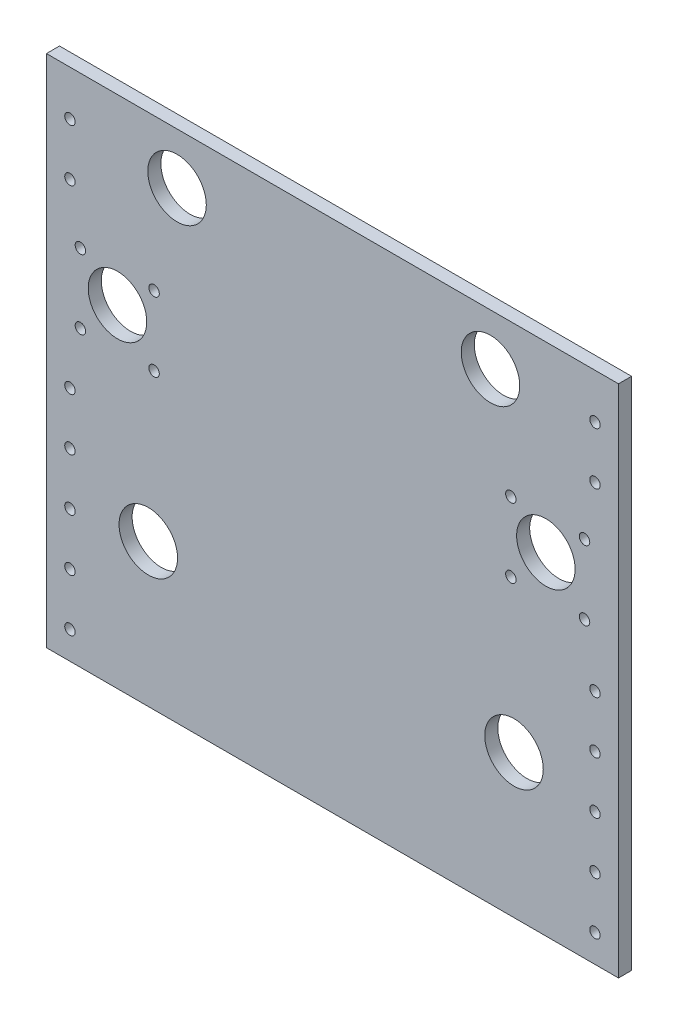
ISO-10303-21;
HEADER;
FILE_DESCRIPTION(('STEP AP214'),'2;1');
FILE_NAME('part.step','',(''),(''),'','','');
FILE_SCHEMA(('AUTOMOTIVE_DESIGN { 1 0 10303 214 1 1 1 1 }'));
ENDSEC;
DATA;
#1=APPLICATION_CONTEXT('core data for automotive mechanical design processes');
#2=APPLICATION_PROTOCOL_DEFINITION('international standard','automotive_design',2000,#1);
#3=PRODUCT_CONTEXT('',#1,'mechanical');
#4=PRODUCT('Part','Part','',(#3));
#5=PRODUCT_RELATED_PRODUCT_CATEGORY('part','',(#4));
#6=PRODUCT_DEFINITION_FORMATION('','',#4);
#7=PRODUCT_DEFINITION_CONTEXT('part definition',#1,'design');
#8=PRODUCT_DEFINITION('design','',#6,#7);
#9=PRODUCT_DEFINITION_SHAPE('','',#8);
#10=(LENGTH_UNIT() NAMED_UNIT(*) SI_UNIT(.MILLI.,.METRE.));
#11=(NAMED_UNIT(*) PLANE_ANGLE_UNIT() SI_UNIT($,.RADIAN.));
#12=(NAMED_UNIT(*) SI_UNIT($,.STERADIAN.) SOLID_ANGLE_UNIT());
#13=UNCERTAINTY_MEASURE_WITH_UNIT(LENGTH_MEASURE(1.E-05),#10,'distance_accuracy_value','');
#14=(GEOMETRIC_REPRESENTATION_CONTEXT(3) GLOBAL_UNCERTAINTY_ASSIGNED_CONTEXT((#13)) GLOBAL_UNIT_ASSIGNED_CONTEXT((#10,
#11,#12)) REPRESENTATION_CONTEXT('',''));
#15=CARTESIAN_POINT('',(0.,0.,0.));
#16=DIRECTION('',(0.,0.,1.));
#17=DIRECTION('',(1.,0.,0.));
#18=AXIS2_PLACEMENT_3D('',#15,#16,#17);
#19=CARTESIAN_POINT('',(0.,250.19,6.35));
#20=DIRECTION('',(0.,1.,0.));
#21=DIRECTION('',(0.,0.,1.));
#22=AXIS2_PLACEMENT_3D('',#19,#20,#21);
#23=PLANE('',#22);
#24=DIRECTION('',(1.,0.,0.));
#25=VECTOR('',#24,1.);
#26=CARTESIAN_POINT('',(0.,250.19,0.));
#27=LINE('',#26,#25);
#28=CARTESIAN_POINT('',(0.,250.19,0.));
#29=VERTEX_POINT('',#28);
#30=CARTESIAN_POINT('',(278.13,250.19,0.));
#31=VERTEX_POINT('',#30);
#32=EDGE_CURVE('E116',#29,#31,#27,.T.);
#33=ORIENTED_EDGE('',*,*,#32,.F.);
#34=DIRECTION('',(0.,0.,-1.));
#35=VECTOR('',#34,1.);
#36=CARTESIAN_POINT('',(0.,250.19,6.35));
#37=LINE('',#36,#35);
#38=CARTESIAN_POINT('',(0.,250.19,6.35));
#39=VERTEX_POINT('',#38);
#40=EDGE_CURVE('E11',#39,#29,#37,.T.);
#41=ORIENTED_EDGE('',*,*,#40,.F.);
#42=DIRECTION('',(1.,0.,0.));
#43=VECTOR('',#42,1.);
#44=CARTESIAN_POINT('',(0.,250.19,6.35));
#45=LINE('',#44,#43);
#46=CARTESIAN_POINT('',(278.13,250.19,6.35));
#47=VERTEX_POINT('',#46);
#48=EDGE_CURVE('E107',#39,#47,#45,.T.);
#49=ORIENTED_EDGE('',*,*,#48,.T.);
#50=DIRECTION('',(0.,0.,-1.));
#51=VECTOR('',#50,1.);
#52=CARTESIAN_POINT('',(278.13,250.19,6.35));
#53=LINE('',#52,#51);
#54=EDGE_CURVE('E48',#47,#31,#53,.T.);
#55=ORIENTED_EDGE('',*,*,#54,.T.);
#56=EDGE_LOOP('',(#33,#41,#49,#55));
#57=FACE_BOUND('',#56,.T.);
#58=ADVANCED_FACE('F45',(#57),#23,.T.);
#59=CARTESIAN_POINT('',(0.,0.,6.35));
#60=DIRECTION('',(-1.,0.,0.));
#61=DIRECTION('',(0.,-1.,0.));
#62=AXIS2_PLACEMENT_3D('',#59,#60,#61);
#63=PLANE('',#62);
#64=DIRECTION('',(0.,1.,0.));
#65=VECTOR('',#64,1.);
#66=CARTESIAN_POINT('',(0.,0.,0.));
#67=LINE('',#66,#65);
#68=CARTESIAN_POINT('',(0.,0.,0.));
#69=VERTEX_POINT('',#68);
#70=EDGE_CURVE('E110',#69,#29,#67,.T.);
#71=ORIENTED_EDGE('',*,*,#70,.F.);
#72=DIRECTION('',(0.,0.,-1.));
#73=VECTOR('',#72,1.);
#74=CARTESIAN_POINT('',(0.,0.,6.35));
#75=LINE('',#74,#73);
#76=CARTESIAN_POINT('',(0.,0.,6.35));
#77=VERTEX_POINT('',#76);
#78=EDGE_CURVE('E55',#77,#69,#75,.T.);
#79=ORIENTED_EDGE('',*,*,#78,.F.);
#80=DIRECTION('',(0.,1.,0.));
#81=VECTOR('',#80,1.);
#82=CARTESIAN_POINT('',(0.,0.,6.35));
#83=LINE('',#82,#81);
#84=EDGE_CURVE('E94',#77,#39,#83,.T.);
#85=ORIENTED_EDGE('',*,*,#84,.T.);
#86=ORIENTED_EDGE('',*,*,#40,.T.);
#87=EDGE_LOOP('',(#71,#79,#85,#86));
#88=FACE_BOUND('',#87,.T.);
#89=ADVANCED_FACE('F133',(#88),#63,.T.);
#90=CARTESIAN_POINT('',(0.,0.,6.35));
#91=DIRECTION('',(0.,1.,0.));
#92=DIRECTION('',(0.,0.,1.));
#93=AXIS2_PLACEMENT_3D('',#90,#91,#92);
#94=PLANE('',#93);
#95=DIRECTION('',(1.,0.,0.));
#96=VECTOR('',#95,1.);
#97=CARTESIAN_POINT('',(0.,0.,0.));
#98=LINE('',#97,#96);
#99=CARTESIAN_POINT('',(278.13,0.,0.));
#100=VERTEX_POINT('',#99);
#101=EDGE_CURVE('E100',#69,#100,#98,.T.);
#102=ORIENTED_EDGE('',*,*,#101,.T.);
#103=DIRECTION('',(0.,0.,-1.));
#104=VECTOR('',#103,1.);
#105=CARTESIAN_POINT('',(278.13,0.,6.35));
#106=LINE('',#105,#104);
#107=CARTESIAN_POINT('',(278.13,0.,6.35));
#108=VERTEX_POINT('',#107);
#109=EDGE_CURVE('E98',#108,#100,#106,.T.);
#110=ORIENTED_EDGE('',*,*,#109,.F.);
#111=DIRECTION('',(1.,0.,0.));
#112=VECTOR('',#111,1.);
#113=CARTESIAN_POINT('',(0.,0.,6.35));
#114=LINE('',#113,#112);
#115=EDGE_CURVE('E91',#77,#108,#114,.T.);
#116=ORIENTED_EDGE('',*,*,#115,.F.);
#117=ORIENTED_EDGE('',*,*,#78,.T.);
#118=EDGE_LOOP('',(#102,#110,#116,#117));
#119=FACE_BOUND('',#118,.T.);
#120=ADVANCED_FACE('F99',(#119),#94,.F.);
#121=CARTESIAN_POINT('',(278.13,0.,6.35));
#122=DIRECTION('',(-1.,0.,0.));
#123=DIRECTION('',(0.,-1.,0.));
#124=AXIS2_PLACEMENT_3D('',#121,#122,#123);
#125=PLANE('',#124);
#126=DIRECTION('',(0.,1.,0.));
#127=VECTOR('',#126,1.);
#128=CARTESIAN_POINT('',(278.13,0.,0.));
#129=LINE('',#128,#127);
#130=EDGE_CURVE('E120',#100,#31,#129,.T.);
#131=ORIENTED_EDGE('',*,*,#130,.T.);
#132=ORIENTED_EDGE('',*,*,#54,.F.);
#133=DIRECTION('',(0.,1.,0.));
#134=VECTOR('',#133,1.);
#135=CARTESIAN_POINT('',(278.13,0.,6.35));
#136=LINE('',#135,#134);
#137=EDGE_CURVE('E88',#108,#47,#136,.T.);
#138=ORIENTED_EDGE('',*,*,#137,.F.);
#139=ORIENTED_EDGE('',*,*,#109,.T.);
#140=EDGE_LOOP('',(#131,#132,#138,#139));
#141=FACE_BOUND('',#140,.T.);
#142=ADVANCED_FACE('F105',(#141),#125,.F.);
#143=CARTESIAN_POINT('',(0.,0.,6.35));
#144=DIRECTION('',(0.,0.,1.));
#145=DIRECTION('',(1.,0.,0.));
#146=AXIS2_PLACEMENT_3D('',#143,#144,#145);
#147=PLANE('',#146);
#148=CARTESIAN_POINT('',(16.51,142.748,6.35));
#149=DIRECTION('',(0.,0.,1.));
#150=DIRECTION('',(1.,0.,0.));
#151=AXIS2_PLACEMENT_3D('',#148,#149,#150);
#152=CIRCLE('',#151,2.54);
#153=CARTESIAN_POINT('',(19.05,142.748,6.35));
#154=VERTEX_POINT('',#153);
#155=EDGE_CURVE('E333',#154,#154,#152,.T.);
#156=ORIENTED_EDGE('',*,*,#155,.F.);
#157=EDGE_LOOP('',(#156));
#158=FACE_BOUND('',#157,.T.);
#159=CARTESIAN_POINT('',(52.324,142.748,6.35));
#160=DIRECTION('',(0.,0.,1.));
#161=DIRECTION('',(1.,0.,0.));
#162=AXIS2_PLACEMENT_3D('',#159,#160,#161);
#163=CIRCLE('',#162,2.54);
#164=CARTESIAN_POINT('',(54.864,142.748,6.35));
#165=VERTEX_POINT('',#164);
#166=EDGE_CURVE('E329',#165,#165,#163,.T.);
#167=ORIENTED_EDGE('',*,*,#166,.F.);
#168=EDGE_LOOP('',(#167));
#169=FACE_BOUND('',#168,.T.);
#170=CARTESIAN_POINT('',(52.324,176.53,6.35));
#171=DIRECTION('',(0.,0.,1.));
#172=DIRECTION('',(1.,0.,0.));
#173=AXIS2_PLACEMENT_3D('',#170,#171,#172);
#174=CIRCLE('',#173,2.54000000000002);
#175=CARTESIAN_POINT('',(54.864,176.53,6.35));
#176=VERTEX_POINT('',#175);
#177=EDGE_CURVE('E325',#176,#176,#174,.T.);
#178=ORIENTED_EDGE('',*,*,#177,.F.);
#179=EDGE_LOOP('',(#178));
#180=FACE_BOUND('',#179,.T.);
#181=CARTESIAN_POINT('',(225.806,176.53,6.35));
#182=DIRECTION('',(0.,0.,1.));
#183=DIRECTION('',(1.,0.,0.));
#184=AXIS2_PLACEMENT_3D('',#181,#182,#183);
#185=CIRCLE('',#184,2.53999999999998);
#186=CARTESIAN_POINT('',(228.346,176.53,6.35));
#187=VERTEX_POINT('',#186);
#188=EDGE_CURVE('E321',#187,#187,#185,.T.);
#189=ORIENTED_EDGE('',*,*,#188,.F.);
#190=EDGE_LOOP('',(#189));
#191=FACE_BOUND('',#190,.T.);
#192=CARTESIAN_POINT('',(261.62,142.748,6.35));
#193=DIRECTION('',(0.,0.,1.));
#194=DIRECTION('',(1.,0.,0.));
#195=AXIS2_PLACEMENT_3D('',#192,#193,#194);
#196=CIRCLE('',#195,2.54000000000006);
#197=CARTESIAN_POINT('',(264.16,142.748,6.35));
#198=VERTEX_POINT('',#197);
#199=EDGE_CURVE('E271',#198,#198,#196,.T.);
#200=ORIENTED_EDGE('',*,*,#199,.F.);
#201=EDGE_LOOP('',(#200));
#202=FACE_BOUND('',#201,.T.);
#203=CARTESIAN_POINT('',(225.806,142.748,6.35));
#204=DIRECTION('',(0.,0.,1.));
#205=DIRECTION('',(1.,0.,0.));
#206=AXIS2_PLACEMENT_3D('',#203,#204,#205);
#207=CIRCLE('',#206,2.53999999999998);
#208=CARTESIAN_POINT('',(228.346,142.748,6.35));
#209=VERTEX_POINT('',#208);
#210=EDGE_CURVE('E315',#209,#209,#207,.T.);
#211=ORIENTED_EDGE('',*,*,#210,.F.);
#212=EDGE_LOOP('',(#211));
#213=FACE_BOUND('',#212,.T.);
#214=CARTESIAN_POINT('',(261.62,176.53,6.35));
#215=DIRECTION('',(0.,0.,1.));
#216=DIRECTION('',(1.,0.,0.));
#217=AXIS2_PLACEMENT_3D('',#214,#215,#216);
#218=CIRCLE('',#217,2.54000000000001);
#219=CARTESIAN_POINT('',(264.16,176.53,6.35));
#220=VERTEX_POINT('',#219);
#221=EDGE_CURVE('E311',#220,#220,#218,.T.);
#222=ORIENTED_EDGE('',*,*,#221,.F.);
#223=EDGE_LOOP('',(#222));
#224=FACE_BOUND('',#223,.T.);
#225=CARTESIAN_POINT('',(16.51,176.53,6.35));
#226=DIRECTION('',(0.,0.,1.));
#227=DIRECTION('',(1.,0.,0.));
#228=AXIS2_PLACEMENT_3D('',#225,#226,#227);
#229=CIRCLE('',#228,2.54000000000001);
#230=CARTESIAN_POINT('',(19.05,176.53,6.35));
#231=VERTEX_POINT('',#230);
#232=EDGE_CURVE('E307',#231,#231,#229,.T.);
#233=ORIENTED_EDGE('',*,*,#232,.F.);
#234=EDGE_LOOP('',(#233));
#235=FACE_BOUND('',#234,.T.);
#236=CARTESIAN_POINT('',(11.43,115.062,6.35));
#237=DIRECTION('',(0.,0.,1.));
#238=DIRECTION('',(1.,0.,0.));
#239=AXIS2_PLACEMENT_3D('',#236,#237,#238);
#240=CIRCLE('',#239,2.54000000000001);
#241=CARTESIAN_POINT('',(13.97,115.062,6.35));
#242=VERTEX_POINT('',#241);
#243=EDGE_CURVE('E445',#242,#242,#240,.T.);
#244=ORIENTED_EDGE('',*,*,#243,.F.);
#245=EDGE_LOOP('',(#244));
#246=FACE_BOUND('',#245,.T.);
#247=CARTESIAN_POINT('',(266.7,228.346,6.35));
#248=DIRECTION('',(0.,0.,1.));
#249=DIRECTION('',(1.,0.,0.));
#250=AXIS2_PLACEMENT_3D('',#247,#248,#249);
#251=CIRCLE('',#250,2.54000000000001);
#252=CARTESIAN_POINT('',(269.24,228.346,6.35));
#253=VERTEX_POINT('',#252);
#254=EDGE_CURVE('E441',#253,#253,#251,.T.);
#255=ORIENTED_EDGE('',*,*,#254,.F.);
#256=EDGE_LOOP('',(#255));
#257=FACE_BOUND('',#256,.T.);
#258=CARTESIAN_POINT('',(266.7,202.946,6.35));
#259=DIRECTION('',(0.,0.,1.));
#260=DIRECTION('',(1.,0.,0.));
#261=AXIS2_PLACEMENT_3D('',#258,#259,#260);
#262=CIRCLE('',#261,2.54000000000001);
#263=CARTESIAN_POINT('',(269.24,202.946,6.35));
#264=VERTEX_POINT('',#263);
#265=EDGE_CURVE('E437',#264,#264,#262,.T.);
#266=ORIENTED_EDGE('',*,*,#265,.F.);
#267=EDGE_LOOP('',(#266));
#268=FACE_BOUND('',#267,.T.);
#269=CARTESIAN_POINT('',(11.43,202.946,6.35));
#270=DIRECTION('',(0.,0.,1.));
#271=DIRECTION('',(1.,0.,0.));
#272=AXIS2_PLACEMENT_3D('',#269,#270,#271);
#273=CIRCLE('',#272,2.54000000000001);
#274=CARTESIAN_POINT('',(13.97,202.946,6.35));
#275=VERTEX_POINT('',#274);
#276=EDGE_CURVE('E433',#275,#275,#273,.T.);
#277=ORIENTED_EDGE('',*,*,#276,.F.);
#278=EDGE_LOOP('',(#277));
#279=FACE_BOUND('',#278,.T.);
#280=CARTESIAN_POINT('',(11.43,89.662,6.35));
#281=DIRECTION('',(0.,0.,1.));
#282=DIRECTION('',(1.,0.,0.));
#283=AXIS2_PLACEMENT_3D('',#280,#281,#282);
#284=CIRCLE('',#283,2.54);
#285=CARTESIAN_POINT('',(13.97,89.662,6.35));
#286=VERTEX_POINT('',#285);
#287=EDGE_CURVE('E429',#286,#286,#284,.T.);
#288=ORIENTED_EDGE('',*,*,#287,.F.);
#289=EDGE_LOOP('',(#288));
#290=FACE_BOUND('',#289,.T.);
#291=CARTESIAN_POINT('',(11.43,64.262,6.35));
#292=DIRECTION('',(0.,0.,1.));
#293=DIRECTION('',(1.,0.,0.));
#294=AXIS2_PLACEMENT_3D('',#291,#292,#293);
#295=CIRCLE('',#294,2.53999999999999);
#296=CARTESIAN_POINT('',(13.97,64.262,6.35));
#297=VERTEX_POINT('',#296);
#298=EDGE_CURVE('E425',#297,#297,#295,.T.);
#299=ORIENTED_EDGE('',*,*,#298,.F.);
#300=EDGE_LOOP('',(#299));
#301=FACE_BOUND('',#300,.T.);
#302=CARTESIAN_POINT('',(11.43,38.862,6.35));
#303=DIRECTION('',(0.,0.,1.));
#304=DIRECTION('',(1.,0.,0.));
#305=AXIS2_PLACEMENT_3D('',#302,#303,#304);
#306=CIRCLE('',#305,2.54);
#307=CARTESIAN_POINT('',(13.97,38.862,6.35));
#308=VERTEX_POINT('',#307);
#309=EDGE_CURVE('E421',#308,#308,#306,.T.);
#310=ORIENTED_EDGE('',*,*,#309,.F.);
#311=EDGE_LOOP('',(#310));
#312=FACE_BOUND('',#311,.T.);
#313=CARTESIAN_POINT('',(11.43,13.462,6.35));
#314=DIRECTION('',(0.,0.,1.));
#315=DIRECTION('',(1.,0.,0.));
#316=AXIS2_PLACEMENT_3D('',#313,#314,#315);
#317=CIRCLE('',#316,2.54);
#318=CARTESIAN_POINT('',(13.97,13.462,6.35));
#319=VERTEX_POINT('',#318);
#320=EDGE_CURVE('E417',#319,#319,#317,.T.);
#321=ORIENTED_EDGE('',*,*,#320,.F.);
#322=EDGE_LOOP('',(#321));
#323=FACE_BOUND('',#322,.T.);
#324=CARTESIAN_POINT('',(266.7,115.062,6.35));
#325=DIRECTION('',(0.,0.,1.));
#326=DIRECTION('',(1.,0.,0.));
#327=AXIS2_PLACEMENT_3D('',#324,#325,#326);
#328=CIRCLE('',#327,2.54000000000001);
#329=CARTESIAN_POINT('',(269.24,115.062,6.35));
#330=VERTEX_POINT('',#329);
#331=EDGE_CURVE('E413',#330,#330,#328,.T.);
#332=ORIENTED_EDGE('',*,*,#331,.F.);
#333=EDGE_LOOP('',(#332));
#334=FACE_BOUND('',#333,.T.);
#335=CARTESIAN_POINT('',(266.7,89.662,6.35));
#336=DIRECTION('',(0.,0.,1.));
#337=DIRECTION('',(1.,0.,0.));
#338=AXIS2_PLACEMENT_3D('',#335,#336,#337);
#339=CIRCLE('',#338,2.54000000000001);
#340=CARTESIAN_POINT('',(269.24,89.662,6.35));
#341=VERTEX_POINT('',#340);
#342=EDGE_CURVE('E409',#341,#341,#339,.T.);
#343=ORIENTED_EDGE('',*,*,#342,.F.);
#344=EDGE_LOOP('',(#343));
#345=FACE_BOUND('',#344,.T.);
#346=CARTESIAN_POINT('',(266.7,64.262,6.35));
#347=DIRECTION('',(0.,0.,1.));
#348=DIRECTION('',(1.,0.,0.));
#349=AXIS2_PLACEMENT_3D('',#346,#347,#348);
#350=CIRCLE('',#349,2.54000000000001);
#351=CARTESIAN_POINT('',(269.24,64.262,6.35));
#352=VERTEX_POINT('',#351);
#353=EDGE_CURVE('E405',#352,#352,#350,.T.);
#354=ORIENTED_EDGE('',*,*,#353,.F.);
#355=EDGE_LOOP('',(#354));
#356=FACE_BOUND('',#355,.T.);
#357=CARTESIAN_POINT('',(266.7,38.862,6.35));
#358=DIRECTION('',(0.,0.,1.));
#359=DIRECTION('',(1.,0.,0.));
#360=AXIS2_PLACEMENT_3D('',#357,#358,#359);
#361=CIRCLE('',#360,2.54000000000001);
#362=CARTESIAN_POINT('',(269.24,38.862,6.35));
#363=VERTEX_POINT('',#362);
#364=EDGE_CURVE('E401',#363,#363,#361,.T.);
#365=ORIENTED_EDGE('',*,*,#364,.F.);
#366=EDGE_LOOP('',(#365));
#367=FACE_BOUND('',#366,.T.);
#368=CARTESIAN_POINT('',(266.7,13.462,6.35));
#369=DIRECTION('',(0.,0.,1.));
#370=DIRECTION('',(1.,0.,0.));
#371=AXIS2_PLACEMENT_3D('',#368,#369,#370);
#372=CIRCLE('',#371,2.54000000000001);
#373=CARTESIAN_POINT('',(269.24,13.462,6.35));
#374=VERTEX_POINT('',#373);
#375=EDGE_CURVE('E397',#374,#374,#372,.T.);
#376=ORIENTED_EDGE('',*,*,#375,.F.);
#377=EDGE_LOOP('',(#376));
#378=FACE_BOUND('',#377,.T.);
#379=CARTESIAN_POINT('',(11.43,228.346,6.35));
#380=DIRECTION('',(0.,0.,1.));
#381=DIRECTION('',(1.,0.,0.));
#382=AXIS2_PLACEMENT_3D('',#379,#380,#381);
#383=CIRCLE('',#382,2.54000000000001);
#384=CARTESIAN_POINT('',(13.97,228.346,6.35));
#385=VERTEX_POINT('',#384);
#386=EDGE_CURVE('E393',#385,#385,#383,.T.);
#387=ORIENTED_EDGE('',*,*,#386,.F.);
#388=EDGE_LOOP('',(#387));
#389=FACE_BOUND('',#388,.T.);
#390=CARTESIAN_POINT('',(49.53,69.596,6.35));
#391=DIRECTION('',(0.,0.,1.));
#392=DIRECTION('',(1.,0.,0.));
#393=AXIS2_PLACEMENT_3D('',#390,#391,#392);
#394=CIRCLE('',#393,14.224);
#395=CARTESIAN_POINT('',(63.754,69.596,6.35));
#396=VERTEX_POINT('',#395);
#397=EDGE_CURVE('E121',#396,#396,#394,.T.);
#398=ORIENTED_EDGE('',*,*,#397,.F.);
#399=EDGE_LOOP('',(#398));
#400=FACE_BOUND('',#399,.T.);
#401=CARTESIAN_POINT('',(242.824,161.544,6.35));
#402=DIRECTION('',(0.,0.,1.));
#403=DIRECTION('',(1.,0.,0.));
#404=AXIS2_PLACEMENT_3D('',#401,#402,#403);
#405=CIRCLE('',#404,14.224);
#406=CARTESIAN_POINT('',(257.048,161.544,6.35));
#407=VERTEX_POINT('',#406);
#408=EDGE_CURVE('E489',#407,#407,#405,.T.);
#409=ORIENTED_EDGE('',*,*,#408,.F.);
#410=EDGE_LOOP('',(#409));
#411=FACE_BOUND('',#410,.T.);
#412=CARTESIAN_POINT('',(34.544,161.544,6.35));
#413=DIRECTION('',(0.,0.,1.));
#414=DIRECTION('',(1.,0.,0.));
#415=AXIS2_PLACEMENT_3D('',#412,#413,#414);
#416=CIRCLE('',#415,14.224);
#417=CARTESIAN_POINT('',(48.768,161.544,6.35));
#418=VERTEX_POINT('',#417);
#419=EDGE_CURVE('E485',#418,#418,#416,.T.);
#420=ORIENTED_EDGE('',*,*,#419,.F.);
#421=EDGE_LOOP('',(#420));
#422=FACE_BOUND('',#421,.T.);
#423=CARTESIAN_POINT('',(215.9,225.298,6.35));
#424=DIRECTION('',(0.,0.,1.));
#425=DIRECTION('',(1.,0.,0.));
#426=AXIS2_PLACEMENT_3D('',#423,#424,#425);
#427=CIRCLE('',#426,14.2240000000001);
#428=CARTESIAN_POINT('',(230.124,225.298,6.35));
#429=VERTEX_POINT('',#428);
#430=EDGE_CURVE('E481',#429,#429,#427,.T.);
#431=ORIENTED_EDGE('',*,*,#430,.F.);
#432=EDGE_LOOP('',(#431));
#433=FACE_BOUND('',#432,.T.);
#434=CARTESIAN_POINT('',(227.33,69.596,6.35));
#435=DIRECTION('',(0.,0.,1.));
#436=DIRECTION('',(1.,0.,0.));
#437=AXIS2_PLACEMENT_3D('',#434,#435,#436);
#438=CIRCLE('',#437,14.224);
#439=CARTESIAN_POINT('',(241.554,69.596,6.35));
#440=VERTEX_POINT('',#439);
#441=EDGE_CURVE('E477',#440,#440,#438,.T.);
#442=ORIENTED_EDGE('',*,*,#441,.F.);
#443=EDGE_LOOP('',(#442));
#444=FACE_BOUND('',#443,.T.);
#445=CARTESIAN_POINT('',(63.5,225.298,6.35));
#446=DIRECTION('',(0.,0.,1.));
#447=DIRECTION('',(1.,0.,0.));
#448=AXIS2_PLACEMENT_3D('',#445,#446,#447);
#449=CIRCLE('',#448,14.224);
#450=CARTESIAN_POINT('',(77.724,225.298,6.35));
#451=VERTEX_POINT('',#450);
#452=EDGE_CURVE('E473',#451,#451,#449,.T.);
#453=ORIENTED_EDGE('',*,*,#452,.F.);
#454=EDGE_LOOP('',(#453));
#455=FACE_BOUND('',#454,.T.);
#456=ORIENTED_EDGE('',*,*,#48,.F.);
#457=ORIENTED_EDGE('',*,*,#84,.F.);
#458=ORIENTED_EDGE('',*,*,#115,.T.);
#459=ORIENTED_EDGE('',*,*,#137,.T.);
#460=EDGE_LOOP('',(#456,#457,#458,#459));
#461=FACE_BOUND('',#460,.T.);
#462=ADVANCED_FACE('F93',(#158,#169,#180,#191,#202,#213,#224,#235,#246,#257,#268,#279,#290,#301,
#312,#323,#334,#345,#356,#367,#378,#389,#400,#411,#422,#433,#444,#455,#461),#147,.T.);
#463=CARTESIAN_POINT('',(0.,0.,0.));
#464=DIRECTION('',(0.,0.,1.));
#465=DIRECTION('',(1.,0.,0.));
#466=AXIS2_PLACEMENT_3D('',#463,#464,#465);
#467=PLANE('',#466);
#468=CARTESIAN_POINT('',(16.51,142.748,0.));
#469=DIRECTION('',(0.,0.,1.));
#470=DIRECTION('',(1.,0.,0.));
#471=AXIS2_PLACEMENT_3D('',#468,#469,#470);
#472=CIRCLE('',#471,2.54);
#473=CARTESIAN_POINT('',(19.05,142.748,0.));
#474=VERTEX_POINT('',#473);
#475=EDGE_CURVE('E288',#474,#474,#472,.T.);
#476=ORIENTED_EDGE('',*,*,#475,.T.);
#477=EDGE_LOOP('',(#476));
#478=FACE_BOUND('',#477,.T.);
#479=CARTESIAN_POINT('',(52.324,142.748,0.));
#480=DIRECTION('',(0.,0.,1.));
#481=DIRECTION('',(1.,0.,0.));
#482=AXIS2_PLACEMENT_3D('',#479,#480,#481);
#483=CIRCLE('',#482,2.54);
#484=CARTESIAN_POINT('',(54.864,142.748,0.));
#485=VERTEX_POINT('',#484);
#486=EDGE_CURVE('E293',#485,#485,#483,.T.);
#487=ORIENTED_EDGE('',*,*,#486,.T.);
#488=EDGE_LOOP('',(#487));
#489=FACE_BOUND('',#488,.T.);
#490=CARTESIAN_POINT('',(52.324,176.53,0.));
#491=DIRECTION('',(0.,0.,1.));
#492=DIRECTION('',(1.,0.,0.));
#493=AXIS2_PLACEMENT_3D('',#490,#491,#492);
#494=CIRCLE('',#493,2.54000000000002);
#495=CARTESIAN_POINT('',(54.864,176.53,0.));
#496=VERTEX_POINT('',#495);
#497=EDGE_CURVE('E297',#496,#496,#494,.T.);
#498=ORIENTED_EDGE('',*,*,#497,.T.);
#499=EDGE_LOOP('',(#498));
#500=FACE_BOUND('',#499,.T.);
#501=CARTESIAN_POINT('',(225.806,176.53,0.));
#502=DIRECTION('',(0.,0.,1.));
#503=DIRECTION('',(1.,0.,0.));
#504=AXIS2_PLACEMENT_3D('',#501,#502,#503);
#505=CIRCLE('',#504,2.53999999999998);
#506=CARTESIAN_POINT('',(228.346,176.53,0.));
#507=VERTEX_POINT('',#506);
#508=EDGE_CURVE('E286',#507,#507,#505,.T.);
#509=ORIENTED_EDGE('',*,*,#508,.T.);
#510=EDGE_LOOP('',(#509));
#511=FACE_BOUND('',#510,.T.);
#512=CARTESIAN_POINT('',(261.62,142.748,0.));
#513=DIRECTION('',(0.,0.,1.));
#514=DIRECTION('',(1.,0.,0.));
#515=AXIS2_PLACEMENT_3D('',#512,#513,#514);
#516=CIRCLE('',#515,2.54000000000006);
#517=CARTESIAN_POINT('',(264.16,142.748,0.));
#518=VERTEX_POINT('',#517);
#519=EDGE_CURVE('E274',#518,#518,#516,.T.);
#520=ORIENTED_EDGE('',*,*,#519,.T.);
#521=EDGE_LOOP('',(#520));
#522=FACE_BOUND('',#521,.T.);
#523=CARTESIAN_POINT('',(225.806,142.748,0.));
#524=DIRECTION('',(0.,0.,1.));
#525=DIRECTION('',(1.,0.,0.));
#526=AXIS2_PLACEMENT_3D('',#523,#524,#525);
#527=CIRCLE('',#526,2.53999999999998);
#528=CARTESIAN_POINT('',(228.346,142.748,0.));
#529=VERTEX_POINT('',#528);
#530=EDGE_CURVE('E277',#529,#529,#527,.T.);
#531=ORIENTED_EDGE('',*,*,#530,.T.);
#532=EDGE_LOOP('',(#531));
#533=FACE_BOUND('',#532,.T.);
#534=CARTESIAN_POINT('',(261.62,176.53,0.));
#535=DIRECTION('',(0.,0.,1.));
#536=DIRECTION('',(1.,0.,0.));
#537=AXIS2_PLACEMENT_3D('',#534,#535,#536);
#538=CIRCLE('',#537,2.54000000000001);
#539=CARTESIAN_POINT('',(264.16,176.53,0.));
#540=VERTEX_POINT('',#539);
#541=EDGE_CURVE('E281',#540,#540,#538,.T.);
#542=ORIENTED_EDGE('',*,*,#541,.T.);
#543=EDGE_LOOP('',(#542));
#544=FACE_BOUND('',#543,.T.);
#545=CARTESIAN_POINT('',(16.51,176.53,0.));
#546=DIRECTION('',(0.,0.,1.));
#547=DIRECTION('',(1.,0.,0.));
#548=AXIS2_PLACEMENT_3D('',#545,#546,#547);
#549=CIRCLE('',#548,2.54000000000001);
#550=CARTESIAN_POINT('',(19.05,176.53,0.));
#551=VERTEX_POINT('',#550);
#552=EDGE_CURVE('E292',#551,#551,#549,.T.);
#553=ORIENTED_EDGE('',*,*,#552,.T.);
#554=EDGE_LOOP('',(#553));
#555=FACE_BOUND('',#554,.T.);
#556=CARTESIAN_POINT('',(11.43,115.062,0.));
#557=DIRECTION('',(0.,0.,1.));
#558=DIRECTION('',(1.,0.,0.));
#559=AXIS2_PLACEMENT_3D('',#556,#557,#558);
#560=CIRCLE('',#559,2.54000000000001);
#561=CARTESIAN_POINT('',(13.97,115.062,0.));
#562=VERTEX_POINT('',#561);
#563=EDGE_CURVE('E363',#562,#562,#560,.T.);
#564=ORIENTED_EDGE('',*,*,#563,.T.);
#565=EDGE_LOOP('',(#564));
#566=FACE_BOUND('',#565,.T.);
#567=CARTESIAN_POINT('',(266.7,228.346,0.));
#568=DIRECTION('',(0.,0.,1.));
#569=DIRECTION('',(1.,0.,0.));
#570=AXIS2_PLACEMENT_3D('',#567,#568,#569);
#571=CIRCLE('',#570,2.54000000000001);
#572=CARTESIAN_POINT('',(269.24,228.346,0.));
#573=VERTEX_POINT('',#572);
#574=EDGE_CURVE('E358',#573,#573,#571,.T.);
#575=ORIENTED_EDGE('',*,*,#574,.T.);
#576=EDGE_LOOP('',(#575));
#577=FACE_BOUND('',#576,.T.);
#578=CARTESIAN_POINT('',(266.7,202.946,0.));
#579=DIRECTION('',(0.,0.,1.));
#580=DIRECTION('',(1.,0.,0.));
#581=AXIS2_PLACEMENT_3D('',#578,#579,#580);
#582=CIRCLE('',#581,2.54000000000001);
#583=CARTESIAN_POINT('',(269.24,202.946,0.));
#584=VERTEX_POINT('',#583);
#585=EDGE_CURVE('E362',#584,#584,#582,.T.);
#586=ORIENTED_EDGE('',*,*,#585,.T.);
#587=EDGE_LOOP('',(#586));
#588=FACE_BOUND('',#587,.T.);
#589=CARTESIAN_POINT('',(11.43,202.946,0.));
#590=DIRECTION('',(0.,0.,1.));
#591=DIRECTION('',(1.,0.,0.));
#592=AXIS2_PLACEMENT_3D('',#589,#590,#591);
#593=CIRCLE('',#592,2.54000000000001);
#594=CARTESIAN_POINT('',(13.97,202.946,0.));
#595=VERTEX_POINT('',#594);
#596=EDGE_CURVE('E368',#595,#595,#593,.T.);
#597=ORIENTED_EDGE('',*,*,#596,.T.);
#598=EDGE_LOOP('',(#597));
#599=FACE_BOUND('',#598,.T.);
#600=CARTESIAN_POINT('',(11.43,89.662,0.));
#601=DIRECTION('',(0.,0.,1.));
#602=DIRECTION('',(1.,0.,0.));
#603=AXIS2_PLACEMENT_3D('',#600,#601,#602);
#604=CIRCLE('',#603,2.54);
#605=CARTESIAN_POINT('',(13.97,89.662,0.));
#606=VERTEX_POINT('',#605);
#607=EDGE_CURVE('E367',#606,#606,#604,.T.);
#608=ORIENTED_EDGE('',*,*,#607,.T.);
#609=EDGE_LOOP('',(#608));
#610=FACE_BOUND('',#609,.T.);
#611=CARTESIAN_POINT('',(11.43,64.262,0.));
#612=DIRECTION('',(0.,0.,1.));
#613=DIRECTION('',(1.,0.,0.));
#614=AXIS2_PLACEMENT_3D('',#611,#612,#613);
#615=CIRCLE('',#614,2.53999999999999);
#616=CARTESIAN_POINT('',(13.97,64.262,0.));
#617=VERTEX_POINT('',#616);
#618=EDGE_CURVE('E379',#617,#617,#615,.T.);
#619=ORIENTED_EDGE('',*,*,#618,.T.);
#620=EDGE_LOOP('',(#619));
#621=FACE_BOUND('',#620,.T.);
#622=CARTESIAN_POINT('',(11.43,38.862,0.));
#623=DIRECTION('',(0.,0.,1.));
#624=DIRECTION('',(1.,0.,0.));
#625=AXIS2_PLACEMENT_3D('',#622,#623,#624);
#626=CIRCLE('',#625,2.54);
#627=CARTESIAN_POINT('',(13.97,38.862,0.));
#628=VERTEX_POINT('',#627);
#629=EDGE_CURVE('E383',#628,#628,#626,.T.);
#630=ORIENTED_EDGE('',*,*,#629,.T.);
#631=EDGE_LOOP('',(#630));
#632=FACE_BOUND('',#631,.T.);
#633=CARTESIAN_POINT('',(11.43,13.462,0.));
#634=DIRECTION('',(0.,0.,1.));
#635=DIRECTION('',(1.,0.,0.));
#636=AXIS2_PLACEMENT_3D('',#633,#634,#635);
#637=CIRCLE('',#636,2.54);
#638=CARTESIAN_POINT('',(13.97,13.462,0.));
#639=VERTEX_POINT('',#638);
#640=EDGE_CURVE('E342',#639,#639,#637,.T.);
#641=ORIENTED_EDGE('',*,*,#640,.T.);
#642=EDGE_LOOP('',(#641));
#643=FACE_BOUND('',#642,.T.);
#644=CARTESIAN_POINT('',(266.7,115.062,0.));
#645=DIRECTION('',(0.,0.,1.));
#646=DIRECTION('',(1.,0.,0.));
#647=AXIS2_PLACEMENT_3D('',#644,#645,#646);
#648=CIRCLE('',#647,2.54000000000001);
#649=CARTESIAN_POINT('',(269.24,115.062,0.));
#650=VERTEX_POINT('',#649);
#651=EDGE_CURVE('E338',#650,#650,#648,.T.);
#652=ORIENTED_EDGE('',*,*,#651,.T.);
#653=EDGE_LOOP('',(#652));
#654=FACE_BOUND('',#653,.T.);
#655=CARTESIAN_POINT('',(266.7,89.662,0.));
#656=DIRECTION('',(0.,0.,1.));
#657=DIRECTION('',(1.,0.,0.));
#658=AXIS2_PLACEMENT_3D('',#655,#656,#657);
#659=CIRCLE('',#658,2.54000000000001);
#660=CARTESIAN_POINT('',(269.24,89.662,0.));
#661=VERTEX_POINT('',#660);
#662=EDGE_CURVE('E343',#661,#661,#659,.T.);
#663=ORIENTED_EDGE('',*,*,#662,.T.);
#664=EDGE_LOOP('',(#663));
#665=FACE_BOUND('',#664,.T.);
#666=CARTESIAN_POINT('',(266.7,64.262,0.));
#667=DIRECTION('',(0.,0.,1.));
#668=DIRECTION('',(1.,0.,0.));
#669=AXIS2_PLACEMENT_3D('',#666,#667,#668);
#670=CIRCLE('',#669,2.54000000000001);
#671=CARTESIAN_POINT('',(269.24,64.262,0.));
#672=VERTEX_POINT('',#671);
#673=EDGE_CURVE('E347',#672,#672,#670,.T.);
#674=ORIENTED_EDGE('',*,*,#673,.T.);
#675=EDGE_LOOP('',(#674));
#676=FACE_BOUND('',#675,.T.);
#677=CARTESIAN_POINT('',(266.7,38.862,0.));
#678=DIRECTION('',(0.,0.,1.));
#679=DIRECTION('',(1.,0.,0.));
#680=AXIS2_PLACEMENT_3D('',#677,#678,#679);
#681=CIRCLE('',#680,2.54000000000001);
#682=CARTESIAN_POINT('',(269.24,38.862,0.));
#683=VERTEX_POINT('',#682);
#684=EDGE_CURVE('E351',#683,#683,#681,.T.);
#685=ORIENTED_EDGE('',*,*,#684,.T.);
#686=EDGE_LOOP('',(#685));
#687=FACE_BOUND('',#686,.T.);
#688=CARTESIAN_POINT('',(266.7,13.462,0.));
#689=DIRECTION('',(0.,0.,1.));
#690=DIRECTION('',(1.,0.,0.));
#691=AXIS2_PLACEMENT_3D('',#688,#689,#690);
#692=CIRCLE('',#691,2.54000000000001);
#693=CARTESIAN_POINT('',(269.24,13.462,0.));
#694=VERTEX_POINT('',#693);
#695=EDGE_CURVE('E337',#694,#694,#692,.T.);
#696=ORIENTED_EDGE('',*,*,#695,.T.);
#697=EDGE_LOOP('',(#696));
#698=FACE_BOUND('',#697,.T.);
#699=CARTESIAN_POINT('',(11.43,228.346,0.));
#700=DIRECTION('',(0.,0.,1.));
#701=DIRECTION('',(1.,0.,0.));
#702=AXIS2_PLACEMENT_3D('',#699,#700,#701);
#703=CIRCLE('',#702,2.54000000000001);
#704=CARTESIAN_POINT('',(13.97,228.346,0.));
#705=VERTEX_POINT('',#704);
#706=EDGE_CURVE('E372',#705,#705,#703,.T.);
#707=ORIENTED_EDGE('',*,*,#706,.T.);
#708=EDGE_LOOP('',(#707));
#709=FACE_BOUND('',#708,.T.);
#710=CARTESIAN_POINT('',(49.53,69.596,0.));
#711=DIRECTION('',(0.,0.,1.));
#712=DIRECTION('',(1.,0.,0.));
#713=AXIS2_PLACEMENT_3D('',#710,#711,#712);
#714=CIRCLE('',#713,14.224);
#715=CARTESIAN_POINT('',(63.754,69.596,0.));
#716=VERTEX_POINT('',#715);
#717=EDGE_CURVE('E453',#716,#716,#714,.T.);
#718=ORIENTED_EDGE('',*,*,#717,.T.);
#719=EDGE_LOOP('',(#718));
#720=FACE_BOUND('',#719,.T.);
#721=CARTESIAN_POINT('',(242.824,161.544,0.));
#722=DIRECTION('',(0.,0.,1.));
#723=DIRECTION('',(1.,0.,0.));
#724=AXIS2_PLACEMENT_3D('',#721,#722,#723);
#725=CIRCLE('',#724,14.224);
#726=CARTESIAN_POINT('',(257.048,161.544,0.));
#727=VERTEX_POINT('',#726);
#728=EDGE_CURVE('E454',#727,#727,#725,.T.);
#729=ORIENTED_EDGE('',*,*,#728,.T.);
#730=EDGE_LOOP('',(#729));
#731=FACE_BOUND('',#730,.T.);
#732=CARTESIAN_POINT('',(34.544,161.544,0.));
#733=DIRECTION('',(0.,0.,1.));
#734=DIRECTION('',(1.,0.,0.));
#735=AXIS2_PLACEMENT_3D('',#732,#733,#734);
#736=CIRCLE('',#735,14.224);
#737=CARTESIAN_POINT('',(48.768,161.544,0.));
#738=VERTEX_POINT('',#737);
#739=EDGE_CURVE('E458',#738,#738,#736,.T.);
#740=ORIENTED_EDGE('',*,*,#739,.T.);
#741=EDGE_LOOP('',(#740));
#742=FACE_BOUND('',#741,.T.);
#743=CARTESIAN_POINT('',(215.9,225.298,0.));
#744=DIRECTION('',(0.,0.,1.));
#745=DIRECTION('',(1.,0.,0.));
#746=AXIS2_PLACEMENT_3D('',#743,#744,#745);
#747=CIRCLE('',#746,14.2240000000001);
#748=CARTESIAN_POINT('',(230.124,225.298,0.));
#749=VERTEX_POINT('',#748);
#750=EDGE_CURVE('E462',#749,#749,#747,.T.);
#751=ORIENTED_EDGE('',*,*,#750,.T.);
#752=EDGE_LOOP('',(#751));
#753=FACE_BOUND('',#752,.T.);
#754=CARTESIAN_POINT('',(227.33,69.596,0.));
#755=DIRECTION('',(0.,0.,1.));
#756=DIRECTION('',(1.,0.,0.));
#757=AXIS2_PLACEMENT_3D('',#754,#755,#756);
#758=CIRCLE('',#757,14.224);
#759=CARTESIAN_POINT('',(241.554,69.596,0.));
#760=VERTEX_POINT('',#759);
#761=EDGE_CURVE('E449',#760,#760,#758,.T.);
#762=ORIENTED_EDGE('',*,*,#761,.T.);
#763=EDGE_LOOP('',(#762));
#764=FACE_BOUND('',#763,.T.);
#765=CARTESIAN_POINT('',(63.5,225.298,0.));
#766=DIRECTION('',(0.,0.,1.));
#767=DIRECTION('',(1.,0.,0.));
#768=AXIS2_PLACEMENT_3D('',#765,#766,#767);
#769=CIRCLE('',#768,14.224);
#770=CARTESIAN_POINT('',(77.724,225.298,0.));
#771=VERTEX_POINT('',#770);
#772=EDGE_CURVE('E466',#771,#771,#769,.T.);
#773=ORIENTED_EDGE('',*,*,#772,.T.);
#774=EDGE_LOOP('',(#773));
#775=FACE_BOUND('',#774,.T.);
#776=ORIENTED_EDGE('',*,*,#32,.T.);
#777=ORIENTED_EDGE('',*,*,#130,.F.);
#778=ORIENTED_EDGE('',*,*,#101,.F.);
#779=ORIENTED_EDGE('',*,*,#70,.T.);
#780=EDGE_LOOP('',(#776,#777,#778,#779));
#781=FACE_BOUND('',#780,.T.);
#782=ADVANCED_FACE('F132',(#478,#489,#500,#511,#522,#533,#544,#555,#566,#577,#588,#599,#610,
#621,#632,#643,#654,#665,#676,#687,#698,#709,#720,#731,#742,#753,#764,#775,#781),#467,.F.);
#783=CARTESIAN_POINT('',(63.5,225.298,0.));
#784=DIRECTION('',(0.,0.,1.));
#785=DIRECTION('',(1.,0.,0.));
#786=AXIS2_PLACEMENT_3D('',#783,#784,#785);
#787=CYLINDRICAL_SURFACE('',#786,14.224);
#788=ORIENTED_EDGE('',*,*,#452,.T.);
#789=EDGE_LOOP('',(#788));
#790=FACE_BOUND('',#789,.T.);
#791=ORIENTED_EDGE('',*,*,#772,.F.);
#792=EDGE_LOOP('',(#791));
#793=FACE_BOUND('',#792,.T.);
#794=ADVANCED_FACE('F153',(#790,#793),#787,.F.);
#795=CARTESIAN_POINT('',(227.33,69.596,0.));
#796=DIRECTION('',(0.,0.,1.));
#797=DIRECTION('',(1.,0.,0.));
#798=AXIS2_PLACEMENT_3D('',#795,#796,#797);
#799=CYLINDRICAL_SURFACE('',#798,14.224);
#800=ORIENTED_EDGE('',*,*,#441,.T.);
#801=EDGE_LOOP('',(#800));
#802=FACE_BOUND('',#801,.T.);
#803=ORIENTED_EDGE('',*,*,#761,.F.);
#804=EDGE_LOOP('',(#803));
#805=FACE_BOUND('',#804,.T.);
#806=ADVANCED_FACE('F159',(#802,#805),#799,.F.);
#807=CARTESIAN_POINT('',(215.9,225.298,0.));
#808=DIRECTION('',(0.,0.,1.));
#809=DIRECTION('',(1.,0.,0.));
#810=AXIS2_PLACEMENT_3D('',#807,#808,#809);
#811=CYLINDRICAL_SURFACE('',#810,14.2240000000001);
#812=ORIENTED_EDGE('',*,*,#430,.T.);
#813=EDGE_LOOP('',(#812));
#814=FACE_BOUND('',#813,.T.);
#815=ORIENTED_EDGE('',*,*,#750,.F.);
#816=EDGE_LOOP('',(#815));
#817=FACE_BOUND('',#816,.T.);
#818=ADVANCED_FACE('F165',(#814,#817),#811,.F.);
#819=CARTESIAN_POINT('',(34.544,161.544,0.));
#820=DIRECTION('',(0.,0.,1.));
#821=DIRECTION('',(1.,0.,0.));
#822=AXIS2_PLACEMENT_3D('',#819,#820,#821);
#823=CYLINDRICAL_SURFACE('',#822,14.224);
#824=ORIENTED_EDGE('',*,*,#419,.T.);
#825=EDGE_LOOP('',(#824));
#826=FACE_BOUND('',#825,.T.);
#827=ORIENTED_EDGE('',*,*,#739,.F.);
#828=EDGE_LOOP('',(#827));
#829=FACE_BOUND('',#828,.T.);
#830=ADVANCED_FACE('F161',(#826,#829),#823,.F.);
#831=CARTESIAN_POINT('',(242.824,161.544,0.));
#832=DIRECTION('',(0.,0.,1.));
#833=DIRECTION('',(1.,0.,0.));
#834=AXIS2_PLACEMENT_3D('',#831,#832,#833);
#835=CYLINDRICAL_SURFACE('',#834,14.224);
#836=ORIENTED_EDGE('',*,*,#408,.T.);
#837=EDGE_LOOP('',(#836));
#838=FACE_BOUND('',#837,.T.);
#839=ORIENTED_EDGE('',*,*,#728,.F.);
#840=EDGE_LOOP('',(#839));
#841=FACE_BOUND('',#840,.T.);
#842=ADVANCED_FACE('F164',(#838,#841),#835,.F.);
#843=CARTESIAN_POINT('',(49.53,69.596,0.));
#844=DIRECTION('',(0.,0.,1.));
#845=DIRECTION('',(1.,0.,0.));
#846=AXIS2_PLACEMENT_3D('',#843,#844,#845);
#847=CYLINDRICAL_SURFACE('',#846,14.224);
#848=ORIENTED_EDGE('',*,*,#397,.T.);
#849=EDGE_LOOP('',(#848));
#850=FACE_BOUND('',#849,.T.);
#851=ORIENTED_EDGE('',*,*,#717,.F.);
#852=EDGE_LOOP('',(#851));
#853=FACE_BOUND('',#852,.T.);
#854=ADVANCED_FACE('F170',(#850,#853),#847,.F.);
#855=CARTESIAN_POINT('',(11.43,228.346,0.));
#856=DIRECTION('',(0.,0.,1.));
#857=DIRECTION('',(1.,0.,0.));
#858=AXIS2_PLACEMENT_3D('',#855,#856,#857);
#859=CYLINDRICAL_SURFACE('',#858,2.54000000000001);
#860=ORIENTED_EDGE('',*,*,#386,.T.);
#861=EDGE_LOOP('',(#860));
#862=FACE_BOUND('',#861,.T.);
#863=ORIENTED_EDGE('',*,*,#706,.F.);
#864=EDGE_LOOP('',(#863));
#865=FACE_BOUND('',#864,.T.);
#866=ADVANCED_FACE('F173',(#862,#865),#859,.F.);
#867=CARTESIAN_POINT('',(266.7,13.462,0.));
#868=DIRECTION('',(0.,0.,1.));
#869=DIRECTION('',(1.,0.,0.));
#870=AXIS2_PLACEMENT_3D('',#867,#868,#869);
#871=CYLINDRICAL_SURFACE('',#870,2.54000000000001);
#872=ORIENTED_EDGE('',*,*,#375,.T.);
#873=EDGE_LOOP('',(#872));
#874=FACE_BOUND('',#873,.T.);
#875=ORIENTED_EDGE('',*,*,#695,.F.);
#876=EDGE_LOOP('',(#875));
#877=FACE_BOUND('',#876,.T.);
#878=ADVANCED_FACE('F183',(#874,#877),#871,.F.);
#879=CARTESIAN_POINT('',(266.7,38.862,0.));
#880=DIRECTION('',(0.,0.,1.));
#881=DIRECTION('',(1.,0.,0.));
#882=AXIS2_PLACEMENT_3D('',#879,#880,#881);
#883=CYLINDRICAL_SURFACE('',#882,2.54000000000001);
#884=ORIENTED_EDGE('',*,*,#364,.T.);
#885=EDGE_LOOP('',(#884));
#886=FACE_BOUND('',#885,.T.);
#887=ORIENTED_EDGE('',*,*,#684,.F.);
#888=EDGE_LOOP('',(#887));
#889=FACE_BOUND('',#888,.T.);
#890=ADVANCED_FACE('F220',(#886,#889),#883,.F.);
#891=CARTESIAN_POINT('',(266.7,64.262,0.));
#892=DIRECTION('',(0.,0.,1.));
#893=DIRECTION('',(1.,0.,0.));
#894=AXIS2_PLACEMENT_3D('',#891,#892,#893);
#895=CYLINDRICAL_SURFACE('',#894,2.54000000000001);
#896=ORIENTED_EDGE('',*,*,#353,.T.);
#897=EDGE_LOOP('',(#896));
#898=FACE_BOUND('',#897,.T.);
#899=ORIENTED_EDGE('',*,*,#673,.F.);
#900=EDGE_LOOP('',(#899));
#901=FACE_BOUND('',#900,.T.);
#902=ADVANCED_FACE('F224',(#898,#901),#895,.F.);
#903=CARTESIAN_POINT('',(266.7,89.662,0.));
#904=DIRECTION('',(0.,0.,1.));
#905=DIRECTION('',(1.,0.,0.));
#906=AXIS2_PLACEMENT_3D('',#903,#904,#905);
#907=CYLINDRICAL_SURFACE('',#906,2.54000000000001);
#908=ORIENTED_EDGE('',*,*,#342,.T.);
#909=EDGE_LOOP('',(#908));
#910=FACE_BOUND('',#909,.T.);
#911=ORIENTED_EDGE('',*,*,#662,.F.);
#912=EDGE_LOOP('',(#911));
#913=FACE_BOUND('',#912,.T.);
#914=ADVANCED_FACE('F228',(#910,#913),#907,.F.);
#915=CARTESIAN_POINT('',(266.7,115.062,0.));
#916=DIRECTION('',(0.,0.,1.));
#917=DIRECTION('',(1.,0.,0.));
#918=AXIS2_PLACEMENT_3D('',#915,#916,#917);
#919=CYLINDRICAL_SURFACE('',#918,2.54000000000001);
#920=ORIENTED_EDGE('',*,*,#331,.T.);
#921=EDGE_LOOP('',(#920));
#922=FACE_BOUND('',#921,.T.);
#923=ORIENTED_EDGE('',*,*,#651,.F.);
#924=EDGE_LOOP('',(#923));
#925=FACE_BOUND('',#924,.T.);
#926=ADVANCED_FACE('F189',(#922,#925),#919,.F.);
#927=CARTESIAN_POINT('',(11.43,13.462,0.));
#928=DIRECTION('',(0.,0.,1.));
#929=DIRECTION('',(1.,0.,0.));
#930=AXIS2_PLACEMENT_3D('',#927,#928,#929);
#931=CYLINDRICAL_SURFACE('',#930,2.54);
#932=ORIENTED_EDGE('',*,*,#320,.T.);
#933=EDGE_LOOP('',(#932));
#934=FACE_BOUND('',#933,.T.);
#935=ORIENTED_EDGE('',*,*,#640,.F.);
#936=EDGE_LOOP('',(#935));
#937=FACE_BOUND('',#936,.T.);
#938=ADVANCED_FACE('F185',(#934,#937),#931,.F.);
#939=CARTESIAN_POINT('',(11.43,38.862,0.));
#940=DIRECTION('',(0.,0.,1.));
#941=DIRECTION('',(1.,0.,0.));
#942=AXIS2_PLACEMENT_3D('',#939,#940,#941);
#943=CYLINDRICAL_SURFACE('',#942,2.54);
#944=ORIENTED_EDGE('',*,*,#309,.T.);
#945=EDGE_LOOP('',(#944));
#946=FACE_BOUND('',#945,.T.);
#947=ORIENTED_EDGE('',*,*,#629,.F.);
#948=EDGE_LOOP('',(#947));
#949=FACE_BOUND('',#948,.T.);
#950=ADVANCED_FACE('F188',(#946,#949),#943,.F.);
#951=CARTESIAN_POINT('',(11.43,64.262,0.));
#952=DIRECTION('',(0.,0.,1.));
#953=DIRECTION('',(1.,0.,0.));
#954=AXIS2_PLACEMENT_3D('',#951,#952,#953);
#955=CYLINDRICAL_SURFACE('',#954,2.53999999999999);
#956=ORIENTED_EDGE('',*,*,#298,.T.);
#957=EDGE_LOOP('',(#956));
#958=FACE_BOUND('',#957,.T.);
#959=ORIENTED_EDGE('',*,*,#618,.F.);
#960=EDGE_LOOP('',(#959));
#961=FACE_BOUND('',#960,.T.);
#962=ADVANCED_FACE('F193',(#958,#961),#955,.F.);
#963=CARTESIAN_POINT('',(11.43,89.662,0.));
#964=DIRECTION('',(0.,0.,1.));
#965=DIRECTION('',(1.,0.,0.));
#966=AXIS2_PLACEMENT_3D('',#963,#964,#965);
#967=CYLINDRICAL_SURFACE('',#966,2.54);
#968=ORIENTED_EDGE('',*,*,#287,.T.);
#969=EDGE_LOOP('',(#968));
#970=FACE_BOUND('',#969,.T.);
#971=ORIENTED_EDGE('',*,*,#607,.F.);
#972=EDGE_LOOP('',(#971));
#973=FACE_BOUND('',#972,.T.);
#974=ADVANCED_FACE('F197',(#970,#973),#967,.F.);
#975=CARTESIAN_POINT('',(11.43,202.946,0.));
#976=DIRECTION('',(0.,0.,1.));
#977=DIRECTION('',(1.,0.,0.));
#978=AXIS2_PLACEMENT_3D('',#975,#976,#977);
#979=CYLINDRICAL_SURFACE('',#978,2.54000000000001);
#980=ORIENTED_EDGE('',*,*,#276,.T.);
#981=EDGE_LOOP('',(#980));
#982=FACE_BOUND('',#981,.T.);
#983=ORIENTED_EDGE('',*,*,#596,.F.);
#984=EDGE_LOOP('',(#983));
#985=FACE_BOUND('',#984,.T.);
#986=ADVANCED_FACE('F201',(#982,#985),#979,.F.);
#987=CARTESIAN_POINT('',(266.7,202.946,0.));
#988=DIRECTION('',(0.,0.,1.));
#989=DIRECTION('',(1.,0.,0.));
#990=AXIS2_PLACEMENT_3D('',#987,#988,#989);
#991=CYLINDRICAL_SURFACE('',#990,2.54000000000001);
#992=ORIENTED_EDGE('',*,*,#265,.T.);
#993=EDGE_LOOP('',(#992));
#994=FACE_BOUND('',#993,.T.);
#995=ORIENTED_EDGE('',*,*,#585,.F.);
#996=EDGE_LOOP('',(#995));
#997=FACE_BOUND('',#996,.T.);
#998=ADVANCED_FACE('F203',(#994,#997),#991,.F.);
#999=CARTESIAN_POINT('',(266.7,228.346,0.));
#1000=DIRECTION('',(0.,0.,1.));
#1001=DIRECTION('',(1.,0.,0.));
#1002=AXIS2_PLACEMENT_3D('',#999,#1000,#1001);
#1003=CYLINDRICAL_SURFACE('',#1002,2.54000000000001);
#1004=ORIENTED_EDGE('',*,*,#254,.T.);
#1005=EDGE_LOOP('',(#1004));
#1006=FACE_BOUND('',#1005,.T.);
#1007=ORIENTED_EDGE('',*,*,#574,.F.);
#1008=EDGE_LOOP('',(#1007));
#1009=FACE_BOUND('',#1008,.T.);
#1010=ADVANCED_FACE('F206',(#1006,#1009),#1003,.F.);
#1011=CARTESIAN_POINT('',(11.43,115.062,0.));
#1012=DIRECTION('',(0.,0.,1.));
#1013=DIRECTION('',(1.,0.,0.));
#1014=AXIS2_PLACEMENT_3D('',#1011,#1012,#1013);
#1015=CYLINDRICAL_SURFACE('',#1014,2.54000000000001);
#1016=ORIENTED_EDGE('',*,*,#243,.T.);
#1017=EDGE_LOOP('',(#1016));
#1018=FACE_BOUND('',#1017,.T.);
#1019=ORIENTED_EDGE('',*,*,#563,.F.);
#1020=EDGE_LOOP('',(#1019));
#1021=FACE_BOUND('',#1020,.T.);
#1022=ADVANCED_FACE('F211',(#1018,#1021),#1015,.F.);
#1023=CARTESIAN_POINT('',(16.51,176.53,0.));
#1024=DIRECTION('',(0.,0.,1.));
#1025=DIRECTION('',(1.,0.,0.));
#1026=AXIS2_PLACEMENT_3D('',#1023,#1024,#1025);
#1027=CYLINDRICAL_SURFACE('',#1026,2.54000000000001);
#1028=ORIENTED_EDGE('',*,*,#232,.T.);
#1029=EDGE_LOOP('',(#1028));
#1030=FACE_BOUND('',#1029,.T.);
#1031=ORIENTED_EDGE('',*,*,#552,.F.);
#1032=EDGE_LOOP('',(#1031));
#1033=FACE_BOUND('',#1032,.T.);
#1034=ADVANCED_FACE('F213',(#1030,#1033),#1027,.F.);
#1035=CARTESIAN_POINT('',(261.62,176.53,0.));
#1036=DIRECTION('',(0.,0.,1.));
#1037=DIRECTION('',(1.,0.,0.));
#1038=AXIS2_PLACEMENT_3D('',#1035,#1036,#1037);
#1039=CYLINDRICAL_SURFACE('',#1038,2.54000000000001);
#1040=ORIENTED_EDGE('',*,*,#221,.T.);
#1041=EDGE_LOOP('',(#1040));
#1042=FACE_BOUND('',#1041,.T.);
#1043=ORIENTED_EDGE('',*,*,#541,.F.);
#1044=EDGE_LOOP('',(#1043));
#1045=FACE_BOUND('',#1044,.T.);
#1046=ADVANCED_FACE('F238',(#1042,#1045),#1039,.F.);
#1047=CARTESIAN_POINT('',(225.806,142.748,0.));
#1048=DIRECTION('',(0.,0.,1.));
#1049=DIRECTION('',(1.,0.,0.));
#1050=AXIS2_PLACEMENT_3D('',#1047,#1048,#1049);
#1051=CYLINDRICAL_SURFACE('',#1050,2.53999999999998);
#1052=ORIENTED_EDGE('',*,*,#210,.T.);
#1053=EDGE_LOOP('',(#1052));
#1054=FACE_BOUND('',#1053,.T.);
#1055=ORIENTED_EDGE('',*,*,#530,.F.);
#1056=EDGE_LOOP('',(#1055));
#1057=FACE_BOUND('',#1056,.T.);
#1058=ADVANCED_FACE('F257',(#1054,#1057),#1051,.F.);
#1059=CARTESIAN_POINT('',(261.62,142.748,0.));
#1060=DIRECTION('',(0.,0.,1.));
#1061=DIRECTION('',(1.,0.,0.));
#1062=AXIS2_PLACEMENT_3D('',#1059,#1060,#1061);
#1063=CYLINDRICAL_SURFACE('',#1062,2.54000000000006);
#1064=ORIENTED_EDGE('',*,*,#199,.T.);
#1065=EDGE_LOOP('',(#1064));
#1066=FACE_BOUND('',#1065,.T.);
#1067=ORIENTED_EDGE('',*,*,#519,.F.);
#1068=EDGE_LOOP('',(#1067));
#1069=FACE_BOUND('',#1068,.T.);
#1070=ADVANCED_FACE('F244',(#1066,#1069),#1063,.F.);
#1071=CARTESIAN_POINT('',(225.806,176.53,0.));
#1072=DIRECTION('',(0.,0.,1.));
#1073=DIRECTION('',(1.,0.,0.));
#1074=AXIS2_PLACEMENT_3D('',#1071,#1072,#1073);
#1075=CYLINDRICAL_SURFACE('',#1074,2.53999999999998);
#1076=ORIENTED_EDGE('',*,*,#188,.T.);
#1077=EDGE_LOOP('',(#1076));
#1078=FACE_BOUND('',#1077,.T.);
#1079=ORIENTED_EDGE('',*,*,#508,.F.);
#1080=EDGE_LOOP('',(#1079));
#1081=FACE_BOUND('',#1080,.T.);
#1082=ADVANCED_FACE('F240',(#1078,#1081),#1075,.F.);
#1083=CARTESIAN_POINT('',(52.324,176.53,0.));
#1084=DIRECTION('',(0.,0.,1.));
#1085=DIRECTION('',(1.,0.,0.));
#1086=AXIS2_PLACEMENT_3D('',#1083,#1084,#1085);
#1087=CYLINDRICAL_SURFACE('',#1086,2.54000000000002);
#1088=ORIENTED_EDGE('',*,*,#177,.T.);
#1089=EDGE_LOOP('',(#1088));
#1090=FACE_BOUND('',#1089,.T.);
#1091=ORIENTED_EDGE('',*,*,#497,.F.);
#1092=EDGE_LOOP('',(#1091));
#1093=FACE_BOUND('',#1092,.T.);
#1094=ADVANCED_FACE('F243',(#1090,#1093),#1087,.F.);
#1095=CARTESIAN_POINT('',(52.324,142.748,0.));
#1096=DIRECTION('',(0.,0.,1.));
#1097=DIRECTION('',(1.,0.,0.));
#1098=AXIS2_PLACEMENT_3D('',#1095,#1096,#1097);
#1099=CYLINDRICAL_SURFACE('',#1098,2.54);
#1100=ORIENTED_EDGE('',*,*,#166,.T.);
#1101=EDGE_LOOP('',(#1100));
#1102=FACE_BOUND('',#1101,.T.);
#1103=ORIENTED_EDGE('',*,*,#486,.F.);
#1104=EDGE_LOOP('',(#1103));
#1105=FACE_BOUND('',#1104,.T.);
#1106=ADVANCED_FACE('F248',(#1102,#1105),#1099,.F.);
#1107=CARTESIAN_POINT('',(16.51,142.748,0.));
#1108=DIRECTION('',(0.,0.,1.));
#1109=DIRECTION('',(1.,0.,0.));
#1110=AXIS2_PLACEMENT_3D('',#1107,#1108,#1109);
#1111=CYLINDRICAL_SURFACE('',#1110,2.54);
#1112=ORIENTED_EDGE('',*,*,#155,.T.);
#1113=EDGE_LOOP('',(#1112));
#1114=FACE_BOUND('',#1113,.T.);
#1115=ORIENTED_EDGE('',*,*,#475,.F.);
#1116=EDGE_LOOP('',(#1115));
#1117=FACE_BOUND('',#1116,.T.);
#1118=ADVANCED_FACE('F252',(#1114,#1117),#1111,.F.);
#1119=CLOSED_SHELL('',(#58,#89,#120,#142,#462,#782,#794,#806,#818,#830,#842,#854,#866,#878,#890,
#902,#914,#926,#938,#950,#962,#974,#986,#998,#1010,#1022,#1034,#1046,#1058,#1070,#1082,#1094,
#1106,#1118));
#1120=MANIFOLD_SOLID_BREP('B2',#1119);
#1121=ADVANCED_BREP_SHAPE_REPRESENTATION('',(#18,#1120),#14);
#1122=SHAPE_DEFINITION_REPRESENTATION(#9,#1121);
ENDSEC;
END-ISO-10303-21;
